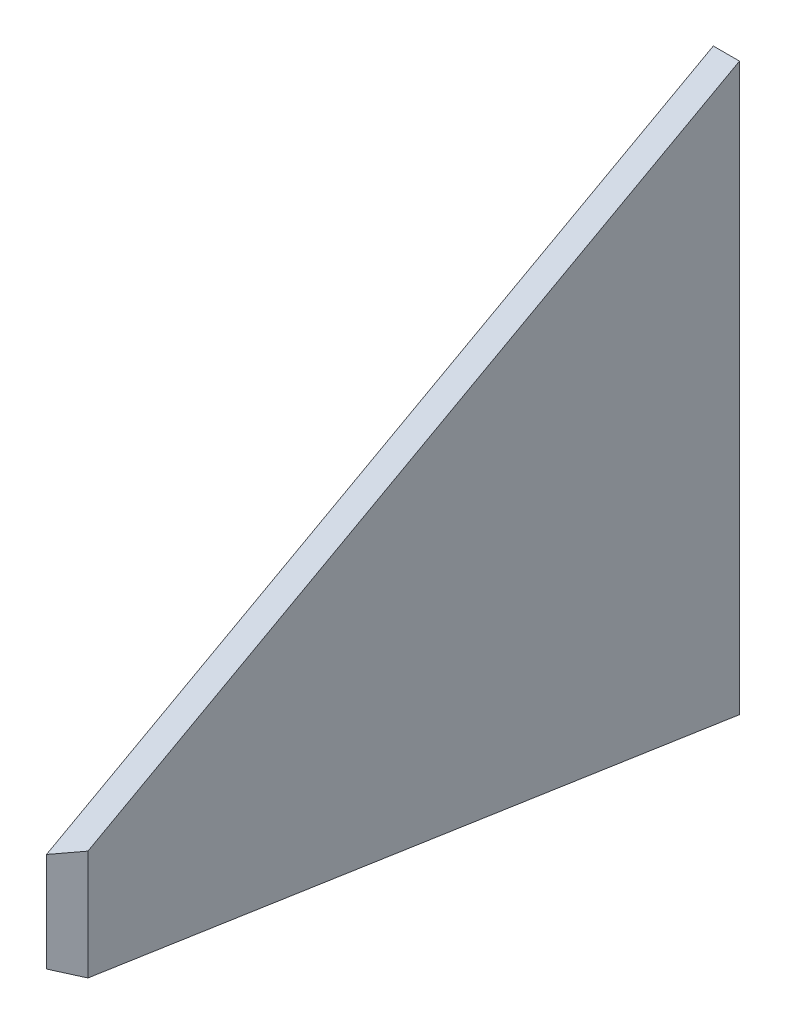
ISO-10303-21;
HEADER;
FILE_DESCRIPTION(('STEP AP214'),'2;1');
FILE_NAME('part.step','',(''),(''),'','','');
FILE_SCHEMA(('AUTOMOTIVE_DESIGN { 1 0 10303 214 1 1 1 1 }'));
ENDSEC;
DATA;
#1=APPLICATION_CONTEXT('core data for automotive mechanical design processes');
#2=APPLICATION_PROTOCOL_DEFINITION('international standard','automotive_design',2000,#1);
#3=PRODUCT_CONTEXT('',#1,'mechanical');
#4=PRODUCT('Part','Part','',(#3));
#5=PRODUCT_RELATED_PRODUCT_CATEGORY('part','',(#4));
#6=PRODUCT_DEFINITION_FORMATION('','',#4);
#7=PRODUCT_DEFINITION_CONTEXT('part definition',#1,'design');
#8=PRODUCT_DEFINITION('design','',#6,#7);
#9=PRODUCT_DEFINITION_SHAPE('','',#8);
#10=(LENGTH_UNIT() NAMED_UNIT(*) SI_UNIT(.MILLI.,.METRE.));
#11=(NAMED_UNIT(*) PLANE_ANGLE_UNIT() SI_UNIT($,.RADIAN.));
#12=(NAMED_UNIT(*) SI_UNIT($,.STERADIAN.) SOLID_ANGLE_UNIT());
#13=UNCERTAINTY_MEASURE_WITH_UNIT(LENGTH_MEASURE(1.E-05),#10,'distance_accuracy_value','');
#14=(GEOMETRIC_REPRESENTATION_CONTEXT(3) GLOBAL_UNCERTAINTY_ASSIGNED_CONTEXT((#13)) GLOBAL_UNIT_ASSIGNED_CONTEXT((#10,
#11,#12)) REPRESENTATION_CONTEXT('',''));
#15=CARTESIAN_POINT('',(0.,0.,0.));
#16=DIRECTION('',(0.,0.,1.));
#17=DIRECTION('',(1.,0.,0.));
#18=AXIS2_PLACEMENT_3D('',#15,#16,#17);
#19=CARTESIAN_POINT('',(-57.15,152.4,0.));
#20=DIRECTION('',(0.,0.,1.));
#21=DIRECTION('',(1.,0.,0.));
#22=AXIS2_PLACEMENT_3D('',#19,#20,#21);
#23=PLANE('',#22);
#24=DIRECTION('',(-1.,0.,0.));
#25=VECTOR('',#24,1.);
#26=CARTESIAN_POINT('',(224.536,6.61458333333333,0.));
#27=LINE('',#26,#25);
#28=CARTESIAN_POINT('',(-50.7124096554344,6.61458333333333,0.));
#29=VERTEX_POINT('',#28);
#30=CARTESIAN_POINT('',(-57.15,6.61458333333332,0.));
#31=VERTEX_POINT('',#30);
#32=EDGE_CURVE('E103',#29,#31,#27,.T.);
#33=ORIENTED_EDGE('',*,*,#32,.T.);
#34=DIRECTION('',(0.,-1.,0.));
#35=VECTOR('',#34,1.);
#36=CARTESIAN_POINT('',(-57.15,152.4,0.));
#37=LINE('',#36,#35);
#38=CARTESIAN_POINT('',(-57.15,145.785416666667,0.));
#39=VERTEX_POINT('',#38);
#40=EDGE_CURVE('E49',#39,#31,#37,.T.);
#41=ORIENTED_EDGE('',*,*,#40,.F.);
#42=DIRECTION('',(-1.,0.,0.));
#43=VECTOR('',#42,1.);
#44=CARTESIAN_POINT('',(224.536,145.785416666667,0.));
#45=LINE('',#44,#43);
#46=CARTESIAN_POINT('',(-50.7124096554344,145.785416666667,0.));
#47=VERTEX_POINT('',#46);
#48=EDGE_CURVE('E97',#47,#39,#45,.T.);
#49=ORIENTED_EDGE('',*,*,#48,.F.);
#50=DIRECTION('',(0.,-1.,0.));
#51=VECTOR('',#50,1.);
#52=CARTESIAN_POINT('',(-50.7124096554344,152.4,0.));
#53=LINE('',#52,#51);
#54=EDGE_CURVE('E85',#47,#29,#53,.T.);
#55=ORIENTED_EDGE('',*,*,#54,.T.);
#56=EDGE_LOOP('',(#33,#41,#49,#55));
#57=FACE_BOUND('',#56,.T.);
#58=ADVANCED_FACE('F40',(#57),#23,.F.);
#59=CARTESIAN_POINT('',(-24.3576833527357,152.4,196.753899883586));
#60=DIRECTION('',(0.986393923832144,0.,-0.164398987305357));
#61=DIRECTION('',(-0.164398987305357,0.,-0.986393923832144));
#62=AXIS2_PLACEMENT_3D('',#59,#60,#61);
#63=PLANE('',#62);
#64=DIRECTION('',(-0.157990501106673,-0.276483376936678,-0.947943006640037));
#65=VECTOR('',#64,1.);
#66=CARTESIAN_POINT('',(-20.4962665805817,70.7586168173153,219.92240051651));
#67=LINE('',#66,#65);
#68=CARTESIAN_POINT('',(-24.3576833527357,64.0011374660458,196.753899883586));
#69=VERTEX_POINT('',#68);
#70=EDGE_CURVE('E114',#69,#31,#67,.T.);
#71=ORIENTED_EDGE('',*,*,#70,.F.);
#72=DIRECTION('',(0.,-1.,0.));
#73=VECTOR('',#72,1.);
#74=CARTESIAN_POINT('',(-24.3576833527357,152.4,196.753899883586));
#75=LINE('',#74,#73);
#76=CARTESIAN_POINT('',(-24.3576833527357,88.3988625339542,196.753899883586));
#77=VERTEX_POINT('',#76);
#78=EDGE_CURVE('E12',#77,#69,#75,.T.);
#79=ORIENTED_EDGE('',*,*,#78,.F.);
#80=DIRECTION('',(0.157990501106673,-0.276483376936678,0.947943006640037));
#81=VECTOR('',#80,1.);
#82=CARTESIAN_POINT('',(-27.1533648645131,93.2913051795645,179.979810812922));
#83=LINE('',#82,#81);
#84=EDGE_CURVE('E101',#39,#77,#83,.T.);
#85=ORIENTED_EDGE('',*,*,#84,.F.);
#86=ORIENTED_EDGE('',*,*,#40,.T.);
#87=EDGE_LOOP('',(#71,#79,#85,#86));
#88=FACE_BOUND('',#87,.T.);
#89=ADVANCED_FACE('F42',(#88),#63,.F.);
#90=CARTESIAN_POINT('',(224.536,152.4,0.));
#91=DIRECTION('',(-0.620146840249803,0.,-0.784485752916001));
#92=DIRECTION('',(-0.784485752916001,0.,0.620146840249803));
#93=AXIS2_PLACEMENT_3D('',#90,#91,#92);
#94=PLANE('',#93);
#95=DIRECTION('',(-0.771959593647215,0.177988048601137,0.610244738061039));
#96=VECTOR('',#95,1.);
#97=CARTESIAN_POINT('',(204.505144736093,11.2330282229033,15.8346681928115));
#98=LINE('',#97,#96);
#99=CARTESIAN_POINT('',(-18.6695214534047,62.6896376868851,192.257329212178));
#100=VERTEX_POINT('',#99);
#101=EDGE_CURVE('E61',#100,#69,#98,.T.);
#102=ORIENTED_EDGE('',*,*,#101,.F.);
#103=DIRECTION('',(0.,1.,0.));
#104=VECTOR('',#103,1.);
#105=CARTESIAN_POINT('',(-18.6695214534048,6.61458333333334,192.257329212178));
#106=LINE('',#105,#104);
#107=CARTESIAN_POINT('',(-18.6695214534048,89.7103623131148,192.257329212178));
#108=VERTEX_POINT('',#107);
#109=EDGE_CURVE('E83',#100,#108,#106,.T.);
#110=ORIENTED_EDGE('',*,*,#109,.T.);
#111=DIRECTION('',(0.771959593647215,0.177988048601137,-0.610244738061039));
#112=VECTOR('',#111,1.);
#113=CARTESIAN_POINT('',(225.444840982936,145.99496498289,-0.718451369909778));
#114=LINE('',#113,#112);
#115=EDGE_CURVE('E94',#77,#108,#114,.T.);
#116=ORIENTED_EDGE('',*,*,#115,.F.);
#117=ORIENTED_EDGE('',*,*,#78,.T.);
#118=EDGE_LOOP('',(#102,#110,#116,#117));
#119=FACE_BOUND('',#118,.T.);
#120=ADVANCED_FACE('F93',(#119),#94,.F.);
#121=CARTESIAN_POINT('',(-18.0940819364016,152.4,195.709966314197));
#122=DIRECTION('',(0.986393923832144,0.,-0.164398987305357));
#123=DIRECTION('',(-0.164398987305357,0.,-0.986393923832144));
#124=AXIS2_PLACEMENT_3D('',#121,#122,#123);
#125=PLANE('',#124);
#126=DIRECTION('',(-0.157990501106673,0.276483376936678,-0.947943006640037));
#127=VECTOR('',#126,1.);
#128=CARTESIAN_POINT('',(-20.8764632024951,93.5725103740229,179.015678717636));
#129=LINE('',#128,#127);
#130=EDGE_CURVE('E80',#108,#47,#129,.T.);
#131=ORIENTED_EDGE('',*,*,#130,.F.);
#132=ORIENTED_EDGE('',*,*,#109,.F.);
#133=DIRECTION('',(0.157990501106673,0.276483376936677,0.947943006640037));
#134=VECTOR('',#133,1.);
#135=CARTESIAN_POINT('',(-14.2193649185638,70.4774116228569,218.958268421224));
#136=LINE('',#135,#134);
#137=EDGE_CURVE('E56',#29,#100,#136,.T.);
#138=ORIENTED_EDGE('',*,*,#137,.F.);
#139=ORIENTED_EDGE('',*,*,#54,.F.);
#140=EDGE_LOOP('',(#131,#132,#138,#139));
#141=FACE_BOUND('',#140,.T.);
#142=ADVANCED_FACE('F82',(#141),#125,.T.);
#143=CARTESIAN_POINT('',(224.536,145.785416666667,0.));
#144=DIRECTION('',(0.,0.96,0.28));
#145=DIRECTION('',(0.,-0.28,0.96));
#146=AXIS2_PLACEMENT_3D('',#143,#144,#145);
#147=PLANE('',#146);
#148=ORIENTED_EDGE('',*,*,#115,.T.);
#149=ORIENTED_EDGE('',*,*,#130,.T.);
#150=ORIENTED_EDGE('',*,*,#48,.T.);
#151=ORIENTED_EDGE('',*,*,#84,.T.);
#152=EDGE_LOOP('',(#148,#149,#150,#151));
#153=FACE_BOUND('',#152,.T.);
#154=ADVANCED_FACE('F99',(#153),#147,.T.);
#155=CARTESIAN_POINT('',(224.536,64.0011374660458,196.753899883586));
#156=DIRECTION('',(0.,-0.96,0.28));
#157=DIRECTION('',(0.,-0.28,-0.96));
#158=AXIS2_PLACEMENT_3D('',#155,#156,#157);
#159=PLANE('',#158);
#160=ORIENTED_EDGE('',*,*,#137,.T.);
#161=ORIENTED_EDGE('',*,*,#101,.T.);
#162=ORIENTED_EDGE('',*,*,#70,.T.);
#163=ORIENTED_EDGE('',*,*,#32,.F.);
#164=EDGE_LOOP('',(#160,#161,#162,#163));
#165=FACE_BOUND('',#164,.T.);
#166=ADVANCED_FACE('F125',(#165),#159,.T.);
#167=CLOSED_SHELL('',(#58,#89,#120,#142,#154,#166));
#168=MANIFOLD_SOLID_BREP('B2',#167);
#169=ADVANCED_BREP_SHAPE_REPRESENTATION('',(#18,#168),#14);
#170=SHAPE_DEFINITION_REPRESENTATION(#9,#169);
ENDSEC;
END-ISO-10303-21;
